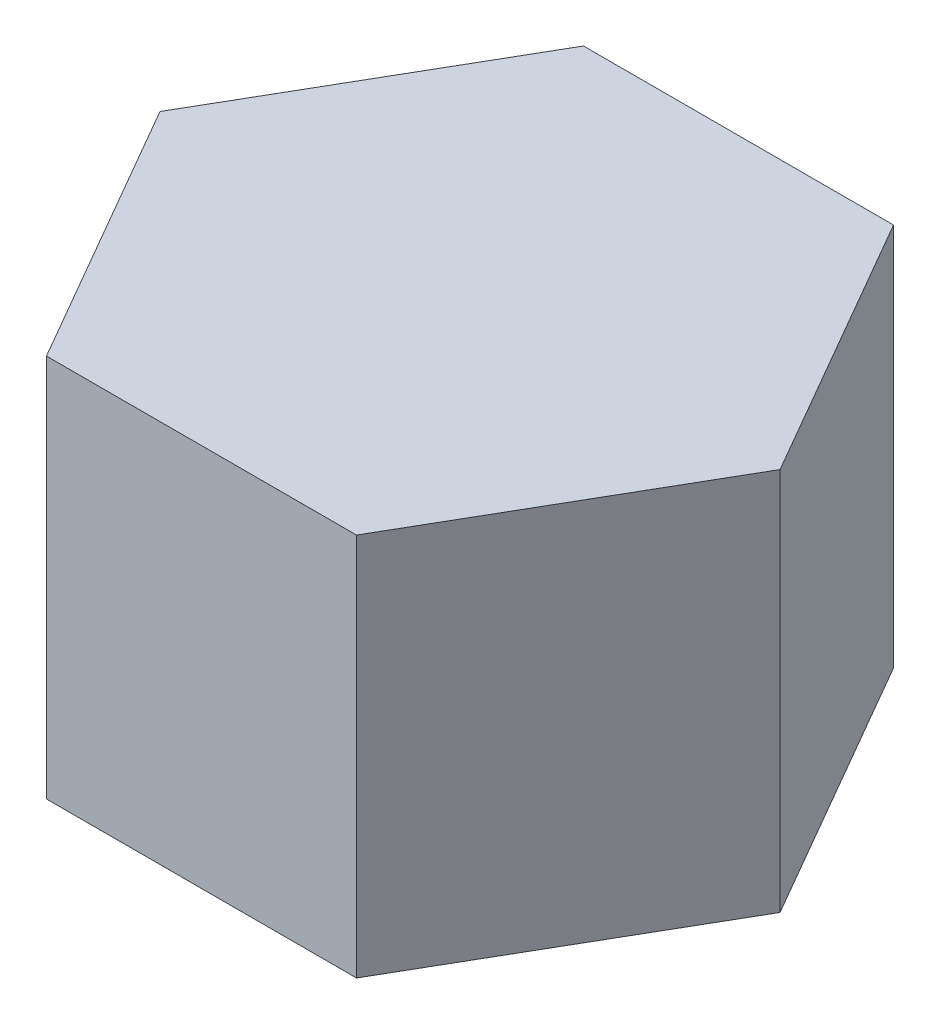
ISO-10303-21;
HEADER;
FILE_DESCRIPTION(('STEP AP214'),'2;1');
FILE_NAME('part.step','',(''),(''),'','','');
FILE_SCHEMA(('AUTOMOTIVE_DESIGN { 1 0 10303 214 1 1 1 1 }'));
ENDSEC;
DATA;
#1=APPLICATION_CONTEXT('core data for automotive mechanical design processes');
#2=APPLICATION_PROTOCOL_DEFINITION('international standard','automotive_design',2000,#1);
#3=PRODUCT_CONTEXT('',#1,'mechanical');
#4=PRODUCT('Part','Part','',(#3));
#5=PRODUCT_RELATED_PRODUCT_CATEGORY('part','',(#4));
#6=PRODUCT_DEFINITION_FORMATION('','',#4);
#7=PRODUCT_DEFINITION_CONTEXT('part definition',#1,'design');
#8=PRODUCT_DEFINITION('design','',#6,#7);
#9=PRODUCT_DEFINITION_SHAPE('','',#8);
#10=(LENGTH_UNIT() NAMED_UNIT(*) SI_UNIT(.MILLI.,.METRE.));
#11=(NAMED_UNIT(*) PLANE_ANGLE_UNIT() SI_UNIT($,.RADIAN.));
#12=(NAMED_UNIT(*) SI_UNIT($,.STERADIAN.) SOLID_ANGLE_UNIT());
#13=UNCERTAINTY_MEASURE_WITH_UNIT(LENGTH_MEASURE(1.E-05),#10,'distance_accuracy_value','');
#14=(GEOMETRIC_REPRESENTATION_CONTEXT(3) GLOBAL_UNCERTAINTY_ASSIGNED_CONTEXT((#13)) GLOBAL_UNIT_ASSIGNED_CONTEXT((#10,
#11,#12)) REPRESENTATION_CONTEXT('',''));
#15=CARTESIAN_POINT('',(0.,0.,0.));
#16=DIRECTION('',(0.,0.,1.));
#17=DIRECTION('',(1.,0.,0.));
#18=AXIS2_PLACEMENT_3D('',#15,#16,#17);
#19=CARTESIAN_POINT('',(44.4559707276012,-30.,77.));
#20=DIRECTION('',(0.866025403784439,0.,0.5));
#21=DIRECTION('',(0.5,0.,-0.866025403784439));
#22=AXIS2_PLACEMENT_3D('',#19,#20,#21);
#23=PLANE('',#22);
#24=DIRECTION('',(0.,1.,0.));
#25=VECTOR('',#24,1.);
#26=CARTESIAN_POINT('',(88.9119414552024,-30.,0.));
#27=LINE('',#26,#25);
#28=CARTESIAN_POINT('',(88.9119414552024,-30.,0.));
#29=VERTEX_POINT('',#28);
#30=CARTESIAN_POINT('',(88.9119414552024,80.,0.));
#31=VERTEX_POINT('',#30);
#32=EDGE_CURVE('E37',#29,#31,#27,.T.);
#33=ORIENTED_EDGE('',*,*,#32,.T.);
#34=DIRECTION('',(0.5,0.,-0.866025403784439));
#35=VECTOR('',#34,1.);
#36=CARTESIAN_POINT('',(44.4559707276012,80.,77.));
#37=LINE('',#36,#35);
#38=CARTESIAN_POINT('',(44.4559707276012,80.,77.));
#39=VERTEX_POINT('',#38);
#40=EDGE_CURVE('E86',#39,#31,#37,.T.);
#41=ORIENTED_EDGE('',*,*,#40,.F.);
#42=DIRECTION('',(0.,1.,0.));
#43=VECTOR('',#42,1.);
#44=CARTESIAN_POINT('',(44.4559707276012,-30.,77.));
#45=LINE('',#44,#43);
#46=CARTESIAN_POINT('',(44.4559707276012,-30.,77.));
#47=VERTEX_POINT('',#46);
#48=EDGE_CURVE('E11',#47,#39,#45,.T.);
#49=ORIENTED_EDGE('',*,*,#48,.F.);
#50=DIRECTION('',(0.5,0.,-0.866025403784439));
#51=VECTOR('',#50,1.);
#52=CARTESIAN_POINT('',(44.4559707276012,-30.,77.));
#53=LINE('',#52,#51);
#54=EDGE_CURVE('E87',#47,#29,#53,.T.);
#55=ORIENTED_EDGE('',*,*,#54,.T.);
#56=EDGE_LOOP('',(#33,#41,#49,#55));
#57=FACE_BOUND('',#56,.T.);
#58=ADVANCED_FACE('F34',(#57),#23,.T.);
#59=CARTESIAN_POINT('',(-44.4559707276012,-30.,77.));
#60=DIRECTION('',(0.,0.,1.));
#61=DIRECTION('',(1.,0.,0.));
#62=AXIS2_PLACEMENT_3D('',#59,#60,#61);
#63=PLANE('',#62);
#64=ORIENTED_EDGE('',*,*,#48,.T.);
#65=DIRECTION('',(1.,0.,0.));
#66=VECTOR('',#65,1.);
#67=CARTESIAN_POINT('',(-44.4559707276012,80.,77.));
#68=LINE('',#67,#66);
#69=CARTESIAN_POINT('',(-44.4559707276012,80.,77.));
#70=VERTEX_POINT('',#69);
#71=EDGE_CURVE('E104',#70,#39,#68,.T.);
#72=ORIENTED_EDGE('',*,*,#71,.F.);
#73=DIRECTION('',(0.,1.,0.));
#74=VECTOR('',#73,1.);
#75=CARTESIAN_POINT('',(-44.4559707276012,-30.,77.));
#76=LINE('',#75,#74);
#77=CARTESIAN_POINT('',(-44.4559707276012,-30.,77.));
#78=VERTEX_POINT('',#77);
#79=EDGE_CURVE('E42',#78,#70,#76,.T.);
#80=ORIENTED_EDGE('',*,*,#79,.F.);
#81=DIRECTION('',(1.,0.,0.));
#82=VECTOR('',#81,1.);
#83=CARTESIAN_POINT('',(-44.4559707276012,-30.,77.));
#84=LINE('',#83,#82);
#85=EDGE_CURVE('E92',#78,#47,#84,.T.);
#86=ORIENTED_EDGE('',*,*,#85,.T.);
#87=EDGE_LOOP('',(#64,#72,#80,#86));
#88=FACE_BOUND('',#87,.T.);
#89=ADVANCED_FACE('F144',(#88),#63,.T.);
#90=CARTESIAN_POINT('',(-88.9119414552024,-30.,0.));
#91=DIRECTION('',(-0.866025403784439,0.,0.5));
#92=DIRECTION('',(0.5,0.,0.866025403784439));
#93=AXIS2_PLACEMENT_3D('',#90,#91,#92);
#94=PLANE('',#93);
#95=ORIENTED_EDGE('',*,*,#79,.T.);
#96=DIRECTION('',(0.5,0.,0.866025403784439));
#97=VECTOR('',#96,1.);
#98=CARTESIAN_POINT('',(-88.9119414552024,80.,0.));
#99=LINE('',#98,#97);
#100=CARTESIAN_POINT('',(-88.9119414552024,80.,0.));
#101=VERTEX_POINT('',#100);
#102=EDGE_CURVE('E111',#101,#70,#99,.T.);
#103=ORIENTED_EDGE('',*,*,#102,.F.);
#104=DIRECTION('',(0.,1.,0.));
#105=VECTOR('',#104,1.);
#106=CARTESIAN_POINT('',(-88.9119414552024,-30.,0.));
#107=LINE('',#106,#105);
#108=CARTESIAN_POINT('',(-88.9119414552024,-30.,0.));
#109=VERTEX_POINT('',#108);
#110=EDGE_CURVE('E127',#109,#101,#107,.T.);
#111=ORIENTED_EDGE('',*,*,#110,.F.);
#112=DIRECTION('',(0.5,0.,0.866025403784439));
#113=VECTOR('',#112,1.);
#114=CARTESIAN_POINT('',(-88.9119414552024,-30.,0.));
#115=LINE('',#114,#113);
#116=EDGE_CURVE('E123',#109,#78,#115,.T.);
#117=ORIENTED_EDGE('',*,*,#116,.T.);
#118=EDGE_LOOP('',(#95,#103,#111,#117));
#119=FACE_BOUND('',#118,.T.);
#120=ADVANCED_FACE('F140',(#119),#94,.T.);
#121=CARTESIAN_POINT('',(-44.4559707276012,-30.,-77.));
#122=DIRECTION('',(-0.866025403784439,0.,-0.5));
#123=DIRECTION('',(-0.5,0.,0.866025403784439));
#124=AXIS2_PLACEMENT_3D('',#121,#122,#123);
#125=PLANE('',#124);
#126=ORIENTED_EDGE('',*,*,#110,.T.);
#127=DIRECTION('',(-0.5,0.,0.866025403784439));
#128=VECTOR('',#127,1.);
#129=CARTESIAN_POINT('',(-44.4559707276012,80.,-77.));
#130=LINE('',#129,#128);
#131=CARTESIAN_POINT('',(-44.4559707276012,80.,-77.));
#132=VERTEX_POINT('',#131);
#133=EDGE_CURVE('E108',#132,#101,#130,.T.);
#134=ORIENTED_EDGE('',*,*,#133,.F.);
#135=DIRECTION('',(0.,1.,0.));
#136=VECTOR('',#135,1.);
#137=CARTESIAN_POINT('',(-44.4559707276012,-30.,-77.));
#138=LINE('',#137,#136);
#139=CARTESIAN_POINT('',(-44.4559707276012,-30.,-77.));
#140=VERTEX_POINT('',#139);
#141=EDGE_CURVE('E129',#140,#132,#138,.T.);
#142=ORIENTED_EDGE('',*,*,#141,.F.);
#143=DIRECTION('',(-0.5,0.,0.866025403784439));
#144=VECTOR('',#143,1.);
#145=CARTESIAN_POINT('',(-44.4559707276012,-30.,-77.));
#146=LINE('',#145,#144);
#147=EDGE_CURVE('E120',#140,#109,#146,.T.);
#148=ORIENTED_EDGE('',*,*,#147,.T.);
#149=EDGE_LOOP('',(#126,#134,#142,#148));
#150=FACE_BOUND('',#149,.T.);
#151=ADVANCED_FACE('F137',(#150),#125,.T.);
#152=CARTESIAN_POINT('',(44.4559707276011,-30.,-77.));
#153=DIRECTION('',(0.,0.,-1.));
#154=DIRECTION('',(-1.,0.,0.));
#155=AXIS2_PLACEMENT_3D('',#152,#153,#154);
#156=PLANE('',#155);
#157=ORIENTED_EDGE('',*,*,#141,.T.);
#158=DIRECTION('',(-1.,0.,0.));
#159=VECTOR('',#158,1.);
#160=CARTESIAN_POINT('',(44.4559707276011,80.,-77.));
#161=LINE('',#160,#159);
#162=CARTESIAN_POINT('',(44.4559707276011,80.,-77.));
#163=VERTEX_POINT('',#162);
#164=EDGE_CURVE('E99',#163,#132,#161,.T.);
#165=ORIENTED_EDGE('',*,*,#164,.F.);
#166=DIRECTION('',(0.,1.,0.));
#167=VECTOR('',#166,1.);
#168=CARTESIAN_POINT('',(44.4559707276011,-30.,-77.));
#169=LINE('',#168,#167);
#170=CARTESIAN_POINT('',(44.4559707276011,-30.,-77.));
#171=VERTEX_POINT('',#170);
#172=EDGE_CURVE('E91',#171,#163,#169,.T.);
#173=ORIENTED_EDGE('',*,*,#172,.F.);
#174=DIRECTION('',(-1.,0.,0.));
#175=VECTOR('',#174,1.);
#176=CARTESIAN_POINT('',(44.4559707276011,-30.,-77.));
#177=LINE('',#176,#175);
#178=EDGE_CURVE('E117',#171,#140,#177,.T.);
#179=ORIENTED_EDGE('',*,*,#178,.T.);
#180=EDGE_LOOP('',(#157,#165,#173,#179));
#181=FACE_BOUND('',#180,.T.);
#182=ADVANCED_FACE('F131',(#181),#156,.T.);
#183=CARTESIAN_POINT('',(88.9119414552024,-30.,0.));
#184=DIRECTION('',(0.866025403784439,0.,-0.5));
#185=DIRECTION('',(-0.5,0.,-0.866025403784439));
#186=AXIS2_PLACEMENT_3D('',#183,#184,#185);
#187=PLANE('',#186);
#188=ORIENTED_EDGE('',*,*,#172,.T.);
#189=DIRECTION('',(-0.5,0.,-0.866025403784439));
#190=VECTOR('',#189,1.);
#191=CARTESIAN_POINT('',(88.9119414552024,80.,0.));
#192=LINE('',#191,#190);
#193=EDGE_CURVE('E94',#31,#163,#192,.T.);
#194=ORIENTED_EDGE('',*,*,#193,.F.);
#195=ORIENTED_EDGE('',*,*,#32,.F.);
#196=DIRECTION('',(-0.5,0.,-0.866025403784439));
#197=VECTOR('',#196,1.);
#198=CARTESIAN_POINT('',(88.9119414552024,-30.,0.));
#199=LINE('',#198,#197);
#200=EDGE_CURVE('E115',#29,#171,#199,.T.);
#201=ORIENTED_EDGE('',*,*,#200,.T.);
#202=EDGE_LOOP('',(#188,#194,#195,#201));
#203=FACE_BOUND('',#202,.T.);
#204=ADVANCED_FACE('F95',(#203),#187,.T.);
#205=CARTESIAN_POINT('',(0.,-30.,0.));
#206=DIRECTION('',(0.,1.,0.));
#207=DIRECTION('',(0.,0.,1.));
#208=AXIS2_PLACEMENT_3D('',#205,#206,#207);
#209=PLANE('',#208);
#210=ORIENTED_EDGE('',*,*,#54,.F.);
#211=ORIENTED_EDGE('',*,*,#85,.F.);
#212=ORIENTED_EDGE('',*,*,#116,.F.);
#213=ORIENTED_EDGE('',*,*,#147,.F.);
#214=ORIENTED_EDGE('',*,*,#178,.F.);
#215=ORIENTED_EDGE('',*,*,#200,.F.);
#216=EDGE_LOOP('',(#210,#211,#212,#213,#214,#215));
#217=FACE_BOUND('',#216,.T.);
#218=ADVANCED_FACE('F143',(#217),#209,.F.);
#219=CARTESIAN_POINT('',(0.,80.,0.));
#220=DIRECTION('',(0.,1.,0.));
#221=DIRECTION('',(0.,0.,1.));
#222=AXIS2_PLACEMENT_3D('',#219,#220,#221);
#223=PLANE('',#222);
#224=ORIENTED_EDGE('',*,*,#40,.T.);
#225=ORIENTED_EDGE('',*,*,#193,.T.);
#226=ORIENTED_EDGE('',*,*,#164,.T.);
#227=ORIENTED_EDGE('',*,*,#133,.T.);
#228=ORIENTED_EDGE('',*,*,#102,.T.);
#229=ORIENTED_EDGE('',*,*,#71,.T.);
#230=EDGE_LOOP('',(#224,#225,#226,#227,#228,#229));
#231=FACE_BOUND('',#230,.T.);
#232=ADVANCED_FACE('F102',(#231),#223,.T.);
#233=CLOSED_SHELL('',(#58,#89,#120,#151,#182,#204,#218,#232));
#234=MANIFOLD_SOLID_BREP('B2',#233);
#235=ADVANCED_BREP_SHAPE_REPRESENTATION('',(#18,#234),#14);
#236=SHAPE_DEFINITION_REPRESENTATION(#9,#235);
ENDSEC;
END-ISO-10303-21;
